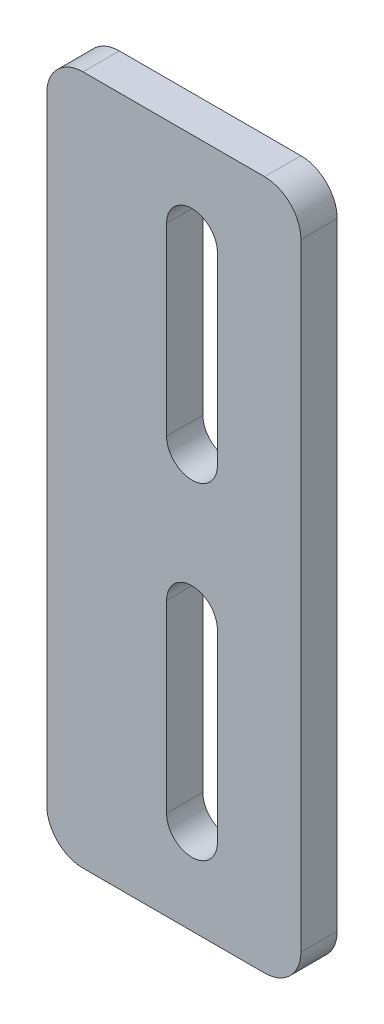
ISO-10303-21;
HEADER;
FILE_DESCRIPTION(('STEP AP214'),'2;1');
FILE_NAME('part.step','',(''),(''),'','','');
FILE_SCHEMA(('AUTOMOTIVE_DESIGN { 1 0 10303 214 1 1 1 1 }'));
ENDSEC;
DATA;
#1=APPLICATION_CONTEXT('core data for automotive mechanical design processes');
#2=APPLICATION_PROTOCOL_DEFINITION('international standard','automotive_design',2000,#1);
#3=PRODUCT_CONTEXT('',#1,'mechanical');
#4=PRODUCT('Part','Part','',(#3));
#5=PRODUCT_RELATED_PRODUCT_CATEGORY('part','',(#4));
#6=PRODUCT_DEFINITION_FORMATION('','',#4);
#7=PRODUCT_DEFINITION_CONTEXT('part definition',#1,'design');
#8=PRODUCT_DEFINITION('design','',#6,#7);
#9=PRODUCT_DEFINITION_SHAPE('','',#8);
#10=(LENGTH_UNIT() NAMED_UNIT(*) SI_UNIT(.MILLI.,.METRE.));
#11=(NAMED_UNIT(*) PLANE_ANGLE_UNIT() SI_UNIT($,.RADIAN.));
#12=(NAMED_UNIT(*) SI_UNIT($,.STERADIAN.) SOLID_ANGLE_UNIT());
#13=UNCERTAINTY_MEASURE_WITH_UNIT(LENGTH_MEASURE(1.E-05),#10,'distance_accuracy_value','');
#14=(GEOMETRIC_REPRESENTATION_CONTEXT(3) GLOBAL_UNCERTAINTY_ASSIGNED_CONTEXT((#13)) GLOBAL_UNIT_ASSIGNED_CONTEXT((#10,
#11,#12)) REPRESENTATION_CONTEXT('',''));
#15=CARTESIAN_POINT('',(0.,0.,0.));
#16=DIRECTION('',(0.,0.,1.));
#17=DIRECTION('',(1.,0.,0.));
#18=AXIS2_PLACEMENT_3D('',#15,#16,#17);
#19=CARTESIAN_POINT('',(6.66133814775094E-13,-64.4730000000013,5.));
#20=DIRECTION('',(0.,1.,0.));
#21=DIRECTION('',(-1.,0.,0.));
#22=AXIS2_PLACEMENT_3D('',#19,#20,#21);
#23=PLANE('',#22);
#24=DIRECTION('',(1.,0.,0.));
#25=VECTOR('',#24,1.);
#26=CARTESIAN_POINT('',(6.66133814775094E-13,-64.4730000000013,5.));
#27=LINE('',#26,#25);
#28=CARTESIAN_POINT('',(5.00000000000068,-64.4730000000013,5.));
#29=VERTEX_POINT('',#28);
#30=CARTESIAN_POINT('',(30.0000000000001,-64.4730000000013,5.));
#31=VERTEX_POINT('',#30);
#32=EDGE_CURVE('E215',#29,#31,#27,.T.);
#33=ORIENTED_EDGE('',*,*,#32,.F.);
#34=DIRECTION('',(0.,0.,-1.));
#35=VECTOR('',#34,1.);
#36=CARTESIAN_POINT('',(5.00000000000067,-64.4730000000013,0.));
#37=LINE('',#36,#35);
#38=CARTESIAN_POINT('',(5.00000000000068,-64.4730000000013,0.));
#39=VERTEX_POINT('',#38);
#40=EDGE_CURVE('E295',#29,#39,#37,.T.);
#41=ORIENTED_EDGE('',*,*,#40,.T.);
#42=DIRECTION('',(1.,0.,0.));
#43=VECTOR('',#42,1.);
#44=CARTESIAN_POINT('',(6.66133814775094E-13,-64.4730000000013,0.));
#45=LINE('',#44,#43);
#46=CARTESIAN_POINT('',(30.0000000000001,-64.4730000000013,0.));
#47=VERTEX_POINT('',#46);
#48=EDGE_CURVE('E258',#39,#47,#45,.T.);
#49=ORIENTED_EDGE('',*,*,#48,.T.);
#50=DIRECTION('',(0.,0.,-1.));
#51=VECTOR('',#50,1.);
#52=CARTESIAN_POINT('',(30.,-64.4730000000013,5.));
#53=LINE('',#52,#51);
#54=EDGE_CURVE('E281',#47,#31,#53,.F.);
#55=ORIENTED_EDGE('',*,*,#54,.T.);
#56=EDGE_LOOP('',(#33,#41,#49,#55));
#57=FACE_BOUND('',#56,.T.);
#58=ADVANCED_FACE('F44',(#57),#23,.F.);
#59=CARTESIAN_POINT('',(35.,0.,5.));
#60=DIRECTION('',(-1.,0.,0.));
#61=DIRECTION('',(0.,-1.,0.));
#62=AXIS2_PLACEMENT_3D('',#59,#60,#61);
#63=PLANE('',#62);
#64=DIRECTION('',(0.,1.,0.));
#65=VECTOR('',#64,1.);
#66=CARTESIAN_POINT('',(35.,0.,5.));
#67=LINE('',#66,#65);
#68=CARTESIAN_POINT('',(35.,-59.4730000000015,5.));
#69=VERTEX_POINT('',#68);
#70=CARTESIAN_POINT('',(35.,25.5269999999994,5.));
#71=VERTEX_POINT('',#70);
#72=EDGE_CURVE('E216',#69,#71,#67,.T.);
#73=ORIENTED_EDGE('',*,*,#72,.F.);
#74=DIRECTION('',(0.,0.,-1.));
#75=VECTOR('',#74,1.);
#76=CARTESIAN_POINT('',(35.,-59.4730000000013,5.));
#77=LINE('',#76,#75);
#78=CARTESIAN_POINT('',(35.,-59.4730000000015,0.));
#79=VERTEX_POINT('',#78);
#80=EDGE_CURVE('E328',#69,#79,#77,.T.);
#81=ORIENTED_EDGE('',*,*,#80,.T.);
#82=DIRECTION('',(0.,1.,0.));
#83=VECTOR('',#82,1.);
#84=CARTESIAN_POINT('',(35.,0.,0.));
#85=LINE('',#84,#83);
#86=CARTESIAN_POINT('',(35.,25.5269999999994,0.));
#87=VERTEX_POINT('',#86);
#88=EDGE_CURVE('E257',#79,#87,#85,.T.);
#89=ORIENTED_EDGE('',*,*,#88,.T.);
#90=DIRECTION('',(0.,0.,-1.));
#91=VECTOR('',#90,1.);
#92=CARTESIAN_POINT('',(35.,25.5269999999993,5.));
#93=LINE('',#92,#91);
#94=EDGE_CURVE('E326',#87,#71,#93,.F.);
#95=ORIENTED_EDGE('',*,*,#94,.T.);
#96=EDGE_LOOP('',(#73,#81,#89,#95));
#97=FACE_BOUND('',#96,.T.);
#98=ADVANCED_FACE('F336',(#97),#63,.F.);
#99=CARTESIAN_POINT('',(1.33226762955019E-12,30.5269999999993,5.));
#100=DIRECTION('',(0.,1.,0.));
#101=DIRECTION('',(-1.,0.,0.));
#102=AXIS2_PLACEMENT_3D('',#99,#100,#101);
#103=PLANE('',#102);
#104=DIRECTION('',(1.,0.,0.));
#105=VECTOR('',#104,1.);
#106=CARTESIAN_POINT('',(1.33226762955019E-12,30.5269999999993,5.));
#107=LINE('',#106,#105);
#108=CARTESIAN_POINT('',(5.00000000000068,30.5269999999993,5.));
#109=VERTEX_POINT('',#108);
#110=CARTESIAN_POINT('',(30.0000000000001,30.5269999999993,5.));
#111=VERTEX_POINT('',#110);
#112=EDGE_CURVE('E218',#109,#111,#107,.T.);
#113=ORIENTED_EDGE('',*,*,#112,.T.);
#114=DIRECTION('',(0.,0.,-1.));
#115=VECTOR('',#114,1.);
#116=CARTESIAN_POINT('',(30.,30.5269999999993,0.));
#117=LINE('',#116,#115);
#118=CARTESIAN_POINT('',(30.0000000000001,30.5269999999993,0.));
#119=VERTEX_POINT('',#118);
#120=EDGE_CURVE('E11',#111,#119,#117,.T.);
#121=ORIENTED_EDGE('',*,*,#120,.T.);
#122=DIRECTION('',(1.,0.,0.));
#123=VECTOR('',#122,1.);
#124=CARTESIAN_POINT('',(1.33226762955019E-12,30.5269999999993,0.));
#125=LINE('',#124,#123);
#126=CARTESIAN_POINT('',(5.00000000000068,30.5269999999993,0.));
#127=VERTEX_POINT('',#126);
#128=EDGE_CURVE('E262',#127,#119,#125,.T.);
#129=ORIENTED_EDGE('',*,*,#128,.F.);
#130=DIRECTION('',(0.,0.,-1.));
#131=VECTOR('',#130,1.);
#132=CARTESIAN_POINT('',(5.00000000000067,30.5269999999993,5.));
#133=LINE('',#132,#131);
#134=EDGE_CURVE('E53',#127,#109,#133,.F.);
#135=ORIENTED_EDGE('',*,*,#134,.T.);
#136=EDGE_LOOP('',(#113,#121,#129,#135));
#137=FACE_BOUND('',#136,.T.);
#138=ADVANCED_FACE('F350',(#137),#103,.T.);
#139=CARTESIAN_POINT('',(20.000000000001,-26.7730000000006,5.));
#140=DIRECTION('',(0.,0.,-1.));
#141=DIRECTION('',(-1.,0.,0.));
#142=AXIS2_PLACEMENT_3D('',#139,#140,#141);
#143=CYLINDRICAL_SURFACE('',#142,3.5);
#144=CARTESIAN_POINT('',(20.000000000001,-26.7730000000006,0.));
#145=DIRECTION('',(0.,0.,1.));
#146=DIRECTION('',(1.,0.,0.));
#147=AXIS2_PLACEMENT_3D('',#144,#145,#146);
#148=CIRCLE('',#147,3.5);
#149=CARTESIAN_POINT('',(23.5000000000011,-26.7730000000008,0.));
#150=VERTEX_POINT('',#149);
#151=CARTESIAN_POINT('',(16.5000000000016,-26.7730000000019,0.));
#152=VERTEX_POINT('',#151);
#153=EDGE_CURVE('E238',#150,#152,#148,.T.);
#154=ORIENTED_EDGE('',*,*,#153,.F.);
#155=DIRECTION('',(0.,0.,-1.));
#156=VECTOR('',#155,1.);
#157=CARTESIAN_POINT('',(23.5000000000011,-26.7730000000008,5.));
#158=LINE('',#157,#156);
#159=CARTESIAN_POINT('',(23.5000000000011,-26.7730000000008,5.));
#160=VERTEX_POINT('',#159);
#161=EDGE_CURVE('E276',#160,#150,#158,.T.);
#162=ORIENTED_EDGE('',*,*,#161,.F.);
#163=CARTESIAN_POINT('',(20.000000000001,-26.7730000000006,5.));
#164=DIRECTION('',(0.,0.,1.));
#165=DIRECTION('',(1.,0.,0.));
#166=AXIS2_PLACEMENT_3D('',#163,#164,#165);
#167=CIRCLE('',#166,3.5);
#168=CARTESIAN_POINT('',(16.5000000000016,-26.7730000000019,5.));
#169=VERTEX_POINT('',#168);
#170=EDGE_CURVE('E198',#160,#169,#167,.T.);
#171=ORIENTED_EDGE('',*,*,#170,.T.);
#172=DIRECTION('',(0.,0.,-1.));
#173=VECTOR('',#172,1.);
#174=CARTESIAN_POINT('',(16.5000000000016,-26.7730000000019,5.));
#175=LINE('',#174,#173);
#176=EDGE_CURVE('E171',#169,#152,#175,.T.);
#177=ORIENTED_EDGE('',*,*,#176,.T.);
#178=EDGE_LOOP('',(#154,#162,#171,#177));
#179=FACE_BOUND('',#178,.T.);
#180=ADVANCED_FACE('F395',(#179),#143,.F.);
#181=CARTESIAN_POINT('',(23.5000000000022,-4.44089209850063E-13,5.));
#182=DIRECTION('',(-1.,0.,0.));
#183=DIRECTION('',(0.,-1.,0.));
#184=AXIS2_PLACEMENT_3D('',#181,#182,#183);
#185=PLANE('',#184);
#186=DIRECTION('',(0.,1.,0.));
#187=VECTOR('',#186,1.);
#188=CARTESIAN_POINT('',(23.5000000000022,-4.44089209850063E-13,0.));
#189=LINE('',#188,#187);
#190=CARTESIAN_POINT('',(23.5000000000011,-52.173000000002,0.));
#191=VERTEX_POINT('',#190);
#192=EDGE_CURVE('E243',#191,#150,#189,.T.);
#193=ORIENTED_EDGE('',*,*,#192,.F.);
#194=DIRECTION('',(0.,0.,-1.));
#195=VECTOR('',#194,1.);
#196=CARTESIAN_POINT('',(23.5000000000011,-52.173000000002,5.));
#197=LINE('',#196,#195);
#198=CARTESIAN_POINT('',(23.5000000000011,-52.173000000002,5.));
#199=VERTEX_POINT('',#198);
#200=EDGE_CURVE('E277',#199,#191,#197,.T.);
#201=ORIENTED_EDGE('',*,*,#200,.F.);
#202=DIRECTION('',(0.,1.,0.));
#203=VECTOR('',#202,1.);
#204=CARTESIAN_POINT('',(23.5000000000022,-4.44089209850063E-13,5.));
#205=LINE('',#204,#203);
#206=EDGE_CURVE('E199',#199,#160,#205,.T.);
#207=ORIENTED_EDGE('',*,*,#206,.T.);
#208=ORIENTED_EDGE('',*,*,#161,.T.);
#209=EDGE_LOOP('',(#193,#201,#207,#208));
#210=FACE_BOUND('',#209,.T.);
#211=ADVANCED_FACE('F386',(#210),#185,.T.);
#212=CARTESIAN_POINT('',(20.000000000001,-52.1730000000007,5.));
#213=DIRECTION('',(0.,0.,-1.));
#214=DIRECTION('',(-1.,0.,0.));
#215=AXIS2_PLACEMENT_3D('',#212,#213,#214);
#216=CYLINDRICAL_SURFACE('',#215,3.5);
#217=CARTESIAN_POINT('',(20.000000000001,-52.1730000000007,0.));
#218=DIRECTION('',(0.,0.,1.));
#219=DIRECTION('',(1.,0.,0.));
#220=AXIS2_PLACEMENT_3D('',#217,#218,#219);
#221=CIRCLE('',#220,3.5);
#222=CARTESIAN_POINT('',(16.5000000000022,-52.1730000000008,0.));
#223=VERTEX_POINT('',#222);
#224=EDGE_CURVE('E246',#223,#191,#221,.T.);
#225=ORIENTED_EDGE('',*,*,#224,.F.);
#226=DIRECTION('',(0.,0.,-1.));
#227=VECTOR('',#226,1.);
#228=CARTESIAN_POINT('',(16.5000000000022,-52.1730000000008,5.));
#229=LINE('',#228,#227);
#230=CARTESIAN_POINT('',(16.5000000000022,-52.1730000000008,5.));
#231=VERTEX_POINT('',#230);
#232=EDGE_CURVE('E272',#231,#223,#229,.T.);
#233=ORIENTED_EDGE('',*,*,#232,.F.);
#234=CARTESIAN_POINT('',(20.000000000001,-52.1730000000007,5.));
#235=DIRECTION('',(0.,0.,1.));
#236=DIRECTION('',(1.,0.,0.));
#237=AXIS2_PLACEMENT_3D('',#234,#235,#236);
#238=CIRCLE('',#237,3.5);
#239=EDGE_CURVE('E204',#231,#199,#238,.T.);
#240=ORIENTED_EDGE('',*,*,#239,.T.);
#241=ORIENTED_EDGE('',*,*,#200,.T.);
#242=EDGE_LOOP('',(#225,#233,#240,#241));
#243=FACE_BOUND('',#242,.T.);
#244=ADVANCED_FACE('F387',(#243),#216,.F.);
#245=CARTESIAN_POINT('',(20.0000000000021,-7.17300000000054,5.));
#246=DIRECTION('',(0.,0.,-1.));
#247=DIRECTION('',(-1.,0.,0.));
#248=AXIS2_PLACEMENT_3D('',#245,#246,#247);
#249=CYLINDRICAL_SURFACE('',#248,3.5);
#250=CARTESIAN_POINT('',(20.0000000000021,-7.17300000000054,0.));
#251=DIRECTION('',(0.,0.,1.));
#252=DIRECTION('',(1.,0.,0.));
#253=AXIS2_PLACEMENT_3D('',#250,#251,#252);
#254=CIRCLE('',#253,3.5);
#255=CARTESIAN_POINT('',(16.5000000000015,-7.17300000000076,0.));
#256=VERTEX_POINT('',#255);
#257=CARTESIAN_POINT('',(23.5000000000022,-7.17300000000076,0.));
#258=VERTEX_POINT('',#257);
#259=EDGE_CURVE('E167',#256,#258,#254,.T.);
#260=ORIENTED_EDGE('',*,*,#259,.F.);
#261=DIRECTION('',(0.,0.,-1.));
#262=VECTOR('',#261,1.);
#263=CARTESIAN_POINT('',(16.5000000000015,-7.17300000000076,5.));
#264=LINE('',#263,#262);
#265=CARTESIAN_POINT('',(16.5000000000015,-7.17300000000076,5.));
#266=VERTEX_POINT('',#265);
#267=EDGE_CURVE('E159',#266,#256,#264,.T.);
#268=ORIENTED_EDGE('',*,*,#267,.F.);
#269=CARTESIAN_POINT('',(20.0000000000021,-7.17300000000054,5.));
#270=DIRECTION('',(0.,0.,1.));
#271=DIRECTION('',(1.,0.,0.));
#272=AXIS2_PLACEMENT_3D('',#269,#270,#271);
#273=CIRCLE('',#272,3.5);
#274=CARTESIAN_POINT('',(23.5000000000022,-7.17300000000076,5.));
#275=VERTEX_POINT('',#274);
#276=EDGE_CURVE('E162',#266,#275,#273,.T.);
#277=ORIENTED_EDGE('',*,*,#276,.T.);
#278=DIRECTION('',(0.,0.,-1.));
#279=VECTOR('',#278,1.);
#280=CARTESIAN_POINT('',(23.5000000000022,-7.17300000000076,5.));
#281=LINE('',#280,#279);
#282=EDGE_CURVE('E229',#275,#258,#281,.T.);
#283=ORIENTED_EDGE('',*,*,#282,.T.);
#284=EDGE_LOOP('',(#260,#268,#277,#283));
#285=FACE_BOUND('',#284,.T.);
#286=ADVANCED_FACE('F165',(#285),#249,.F.);
#287=CARTESIAN_POINT('',(16.5000000000022,-4.44089209850063E-13,5.));
#288=DIRECTION('',(1.,0.,0.));
#289=DIRECTION('',(0.,1.,0.));
#290=AXIS2_PLACEMENT_3D('',#287,#288,#289);
#291=PLANE('',#290);
#292=DIRECTION('',(0.,-1.,0.));
#293=VECTOR('',#292,1.);
#294=CARTESIAN_POINT('',(16.5000000000022,-4.44089209850063E-13,0.));
#295=LINE('',#294,#293);
#296=CARTESIAN_POINT('',(16.5000000000021,18.2269999999993,0.));
#297=VERTEX_POINT('',#296);
#298=EDGE_CURVE('E228',#297,#256,#295,.T.);
#299=ORIENTED_EDGE('',*,*,#298,.F.);
#300=DIRECTION('',(0.,0.,-1.));
#301=VECTOR('',#300,1.);
#302=CARTESIAN_POINT('',(16.5000000000021,18.2269999999993,5.));
#303=LINE('',#302,#301);
#304=CARTESIAN_POINT('',(16.5000000000021,18.2269999999993,5.));
#305=VERTEX_POINT('',#304);
#306=EDGE_CURVE('E175',#305,#297,#303,.T.);
#307=ORIENTED_EDGE('',*,*,#306,.F.);
#308=DIRECTION('',(0.,-1.,0.));
#309=VECTOR('',#308,1.);
#310=CARTESIAN_POINT('',(16.5000000000022,-4.44089209850063E-13,5.));
#311=LINE('',#310,#309);
#312=EDGE_CURVE('E179',#305,#266,#311,.T.);
#313=ORIENTED_EDGE('',*,*,#312,.T.);
#314=ORIENTED_EDGE('',*,*,#267,.T.);
#315=EDGE_LOOP('',(#299,#307,#313,#314));
#316=FACE_BOUND('',#315,.T.);
#317=ADVANCED_FACE('F186',(#316),#291,.T.);
#318=CARTESIAN_POINT('',(20.0000000000008,18.2270000000004,5.));
#319=DIRECTION('',(0.,0.,-1.));
#320=DIRECTION('',(-1.,0.,0.));
#321=AXIS2_PLACEMENT_3D('',#318,#319,#320);
#322=CYLINDRICAL_SURFACE('',#321,3.5);
#323=CARTESIAN_POINT('',(20.0000000000008,18.2270000000004,0.));
#324=DIRECTION('',(0.,0.,1.));
#325=DIRECTION('',(1.,0.,0.));
#326=AXIS2_PLACEMENT_3D('',#323,#324,#325);
#327=CIRCLE('',#326,3.5);
#328=CARTESIAN_POINT('',(23.5000000000011,18.2269999999993,0.));
#329=VERTEX_POINT('',#328);
#330=EDGE_CURVE('E235',#329,#297,#327,.T.);
#331=ORIENTED_EDGE('',*,*,#330,.F.);
#332=DIRECTION('',(0.,0.,-1.));
#333=VECTOR('',#332,1.);
#334=CARTESIAN_POINT('',(23.5000000000011,18.2269999999993,5.));
#335=LINE('',#334,#333);
#336=CARTESIAN_POINT('',(23.5000000000011,18.2269999999993,5.));
#337=VERTEX_POINT('',#336);
#338=EDGE_CURVE('E282',#337,#329,#335,.T.);
#339=ORIENTED_EDGE('',*,*,#338,.F.);
#340=CARTESIAN_POINT('',(20.0000000000008,18.2270000000004,5.));
#341=DIRECTION('',(0.,0.,1.));
#342=DIRECTION('',(1.,0.,0.));
#343=AXIS2_PLACEMENT_3D('',#340,#341,#342);
#344=CIRCLE('',#343,3.5);
#345=EDGE_CURVE('E188',#337,#305,#344,.T.);
#346=ORIENTED_EDGE('',*,*,#345,.T.);
#347=ORIENTED_EDGE('',*,*,#306,.T.);
#348=EDGE_LOOP('',(#331,#339,#346,#347));
#349=FACE_BOUND('',#348,.T.);
#350=ADVANCED_FACE('F383',(#349),#322,.F.);
#351=CARTESIAN_POINT('',(16.5000000000022,-4.44089209850063E-13,5.));
#352=DIRECTION('',(1.,0.,0.));
#353=DIRECTION('',(0.,1.,0.));
#354=AXIS2_PLACEMENT_3D('',#351,#352,#353);
#355=PLANE('',#354);
#356=DIRECTION('',(0.,-1.,0.));
#357=VECTOR('',#356,1.);
#358=CARTESIAN_POINT('',(16.5000000000022,-4.44089209850063E-13,0.));
#359=LINE('',#358,#357);
#360=EDGE_CURVE('E252',#152,#223,#359,.T.);
#361=ORIENTED_EDGE('',*,*,#360,.F.);
#362=ORIENTED_EDGE('',*,*,#176,.F.);
#363=DIRECTION('',(0.,-1.,0.));
#364=VECTOR('',#363,1.);
#365=CARTESIAN_POINT('',(16.5000000000022,-4.44089209850063E-13,5.));
#366=LINE('',#365,#364);
#367=EDGE_CURVE('E208',#169,#231,#366,.T.);
#368=ORIENTED_EDGE('',*,*,#367,.T.);
#369=ORIENTED_EDGE('',*,*,#232,.T.);
#370=EDGE_LOOP('',(#361,#362,#368,#369));
#371=FACE_BOUND('',#370,.T.);
#372=ADVANCED_FACE('F379',(#371),#355,.T.);
#373=CARTESIAN_POINT('',(23.5000000000022,-2.22044604925031E-13,5.));
#374=DIRECTION('',(-1.,0.,0.));
#375=DIRECTION('',(0.,-1.,0.));
#376=AXIS2_PLACEMENT_3D('',#373,#374,#375);
#377=PLANE('',#376);
#378=DIRECTION('',(0.,1.,0.));
#379=VECTOR('',#378,1.);
#380=CARTESIAN_POINT('',(23.5000000000022,-2.22044604925031E-13,0.));
#381=LINE('',#380,#379);
#382=EDGE_CURVE('E237',#258,#329,#381,.T.);
#383=ORIENTED_EDGE('',*,*,#382,.F.);
#384=ORIENTED_EDGE('',*,*,#282,.F.);
#385=DIRECTION('',(0.,1.,0.));
#386=VECTOR('',#385,1.);
#387=CARTESIAN_POINT('',(23.5000000000022,-2.22044604925031E-13,5.));
#388=LINE('',#387,#386);
#389=EDGE_CURVE('E181',#275,#337,#388,.T.);
#390=ORIENTED_EDGE('',*,*,#389,.T.);
#391=ORIENTED_EDGE('',*,*,#338,.T.);
#392=EDGE_LOOP('',(#383,#384,#390,#391));
#393=FACE_BOUND('',#392,.T.);
#394=ADVANCED_FACE('F382',(#393),#377,.T.);
#395=CARTESIAN_POINT('',(6.66133814775094E-13,0.,5.));
#396=DIRECTION('',(-1.,0.,0.));
#397=DIRECTION('',(0.,-1.,0.));
#398=AXIS2_PLACEMENT_3D('',#395,#396,#397);
#399=PLANE('',#398);
#400=DIRECTION('',(0.,1.,0.));
#401=VECTOR('',#400,1.);
#402=CARTESIAN_POINT('',(6.66133814775094E-13,0.,0.));
#403=LINE('',#402,#401);
#404=CARTESIAN_POINT('',(6.66030645565807E-13,-59.4730000000015,0.));
#405=VERTEX_POINT('',#404);
#406=CARTESIAN_POINT('',(6.66178097061265E-13,25.5269999999994,0.));
#407=VERTEX_POINT('',#406);
#408=EDGE_CURVE('E183',#405,#407,#403,.T.);
#409=ORIENTED_EDGE('',*,*,#408,.F.);
#410=DIRECTION('',(0.,0.,-1.));
#411=VECTOR('',#410,1.);
#412=CARTESIAN_POINT('',(6.66030645565807E-13,-59.4730000000013,5.));
#413=LINE('',#412,#411);
#414=CARTESIAN_POINT('',(6.66030645565807E-13,-59.4730000000015,5.));
#415=VERTEX_POINT('',#414);
#416=EDGE_CURVE('E315',#405,#415,#413,.F.);
#417=ORIENTED_EDGE('',*,*,#416,.T.);
#418=DIRECTION('',(0.,1.,0.));
#419=VECTOR('',#418,1.);
#420=CARTESIAN_POINT('',(6.66133814775094E-13,0.,5.));
#421=LINE('',#420,#419);
#422=CARTESIAN_POINT('',(6.66178097061265E-13,25.5269999999994,5.));
#423=VERTEX_POINT('',#422);
#424=EDGE_CURVE('E225',#415,#423,#421,.T.);
#425=ORIENTED_EDGE('',*,*,#424,.T.);
#426=DIRECTION('',(0.,0.,-1.));
#427=VECTOR('',#426,1.);
#428=CARTESIAN_POINT('',(6.66178097061265E-13,25.5269999999993,5.));
#429=LINE('',#428,#427);
#430=EDGE_CURVE('E306',#423,#407,#429,.T.);
#431=ORIENTED_EDGE('',*,*,#430,.T.);
#432=EDGE_LOOP('',(#409,#417,#425,#431));
#433=FACE_BOUND('',#432,.T.);
#434=ADVANCED_FACE('F353',(#433),#399,.T.);
#435=CARTESIAN_POINT('',(0.,0.,5.));
#436=DIRECTION('',(0.,0.,1.));
#437=DIRECTION('',(1.,0.,0.));
#438=AXIS2_PLACEMENT_3D('',#435,#436,#437);
#439=PLANE('',#438);
#440=ORIENTED_EDGE('',*,*,#276,.F.);
#441=ORIENTED_EDGE('',*,*,#312,.F.);
#442=ORIENTED_EDGE('',*,*,#345,.F.);
#443=ORIENTED_EDGE('',*,*,#389,.F.);
#444=EDGE_LOOP('',(#440,#441,#442,#443));
#445=FACE_BOUND('',#444,.T.);
#446=ORIENTED_EDGE('',*,*,#170,.F.);
#447=ORIENTED_EDGE('',*,*,#206,.F.);
#448=ORIENTED_EDGE('',*,*,#239,.F.);
#449=ORIENTED_EDGE('',*,*,#367,.F.);
#450=EDGE_LOOP('',(#446,#447,#448,#449));
#451=FACE_BOUND('',#450,.T.);
#452=ORIENTED_EDGE('',*,*,#424,.F.);
#453=CARTESIAN_POINT('',(5.00000000000067,-59.4730000000013,5.));
#454=DIRECTION('',(0.,0.,1.));
#455=DIRECTION('',(0.,-1.,0.));
#456=AXIS2_PLACEMENT_3D('',#453,#454,#455);
#457=CIRCLE('',#456,5.);
#458=EDGE_CURVE('E323',#415,#29,#457,.T.);
#459=ORIENTED_EDGE('',*,*,#458,.T.);
#460=ORIENTED_EDGE('',*,*,#32,.T.);
#461=CARTESIAN_POINT('',(30.,-59.4730000000013,5.));
#462=DIRECTION('',(0.,0.,1.));
#463=DIRECTION('',(0.,-1.,0.));
#464=AXIS2_PLACEMENT_3D('',#461,#462,#463);
#465=CIRCLE('',#464,5.);
#466=EDGE_CURVE('E319',#31,#69,#465,.T.);
#467=ORIENTED_EDGE('',*,*,#466,.T.);
#468=ORIENTED_EDGE('',*,*,#72,.T.);
#469=CARTESIAN_POINT('',(30.,25.5269999999993,5.));
#470=DIRECTION('',(0.,0.,1.));
#471=DIRECTION('',(0.,-1.,0.));
#472=AXIS2_PLACEMENT_3D('',#469,#470,#471);
#473=CIRCLE('',#472,5.);
#474=EDGE_CURVE('E64',#71,#111,#473,.T.);
#475=ORIENTED_EDGE('',*,*,#474,.T.);
#476=ORIENTED_EDGE('',*,*,#112,.F.);
#477=CARTESIAN_POINT('',(5.00000000000067,25.5269999999993,5.));
#478=DIRECTION('',(0.,0.,1.));
#479=DIRECTION('',(0.,-1.,0.));
#480=AXIS2_PLACEMENT_3D('',#477,#478,#479);
#481=CIRCLE('',#480,5.);
#482=EDGE_CURVE('E312',#109,#423,#481,.T.);
#483=ORIENTED_EDGE('',*,*,#482,.T.);
#484=EDGE_LOOP('',(#452,#459,#460,#467,#468,#475,#476,#483));
#485=FACE_BOUND('',#484,.T.);
#486=ADVANCED_FACE('F180',(#445,#451,#485),#439,.T.);
#487=CARTESIAN_POINT('',(0.,0.,0.));
#488=DIRECTION('',(0.,0.,1.));
#489=DIRECTION('',(1.,0.,0.));
#490=AXIS2_PLACEMENT_3D('',#487,#488,#489);
#491=PLANE('',#490);
#492=ORIENTED_EDGE('',*,*,#259,.T.);
#493=ORIENTED_EDGE('',*,*,#382,.T.);
#494=ORIENTED_EDGE('',*,*,#330,.T.);
#495=ORIENTED_EDGE('',*,*,#298,.T.);
#496=EDGE_LOOP('',(#492,#493,#494,#495));
#497=FACE_BOUND('',#496,.T.);
#498=ORIENTED_EDGE('',*,*,#153,.T.);
#499=ORIENTED_EDGE('',*,*,#360,.T.);
#500=ORIENTED_EDGE('',*,*,#224,.T.);
#501=ORIENTED_EDGE('',*,*,#192,.T.);
#502=EDGE_LOOP('',(#498,#499,#500,#501));
#503=FACE_BOUND('',#502,.T.);
#504=ORIENTED_EDGE('',*,*,#48,.F.);
#505=CARTESIAN_POINT('',(5.00000000000067,-59.4730000000013,0.));
#506=DIRECTION('',(0.,0.,1.));
#507=DIRECTION('',(0.,-1.,0.));
#508=AXIS2_PLACEMENT_3D('',#505,#506,#507);
#509=CIRCLE('',#508,5.);
#510=EDGE_CURVE('E304',#39,#405,#509,.F.);
#511=ORIENTED_EDGE('',*,*,#510,.T.);
#512=ORIENTED_EDGE('',*,*,#408,.T.);
#513=CARTESIAN_POINT('',(5.00000000000067,25.5269999999993,0.));
#514=DIRECTION('',(0.,0.,1.));
#515=DIRECTION('',(0.,-1.,0.));
#516=AXIS2_PLACEMENT_3D('',#513,#514,#515);
#517=CIRCLE('',#516,5.);
#518=EDGE_CURVE('E299',#407,#127,#517,.F.);
#519=ORIENTED_EDGE('',*,*,#518,.T.);
#520=ORIENTED_EDGE('',*,*,#128,.T.);
#521=CARTESIAN_POINT('',(30.,25.5269999999993,0.));
#522=DIRECTION('',(0.,0.,1.));
#523=DIRECTION('',(0.,-1.,0.));
#524=AXIS2_PLACEMENT_3D('',#521,#522,#523);
#525=CIRCLE('',#524,5.);
#526=EDGE_CURVE('E298',#119,#87,#525,.F.);
#527=ORIENTED_EDGE('',*,*,#526,.T.);
#528=ORIENTED_EDGE('',*,*,#88,.F.);
#529=CARTESIAN_POINT('',(30.,-59.4730000000013,0.));
#530=DIRECTION('',(0.,0.,1.));
#531=DIRECTION('',(0.,-1.,0.));
#532=AXIS2_PLACEMENT_3D('',#529,#530,#531);
#533=CIRCLE('',#532,5.);
#534=EDGE_CURVE('E305',#79,#47,#533,.F.);
#535=ORIENTED_EDGE('',*,*,#534,.T.);
#536=EDGE_LOOP('',(#504,#511,#512,#519,#520,#527,#528,#535));
#537=FACE_BOUND('',#536,.T.);
#538=ADVANCED_FACE('F341',(#497,#503,#537),#491,.F.);
#539=CARTESIAN_POINT('',(5.00000000000067,-59.4730000000013,5.));
#540=DIRECTION('',(0.,0.,1.));
#541=DIRECTION('',(1.,0.,0.));
#542=AXIS2_PLACEMENT_3D('',#539,#540,#541);
#543=CYLINDRICAL_SURFACE('',#542,5.);
#544=ORIENTED_EDGE('',*,*,#458,.F.);
#545=ORIENTED_EDGE('',*,*,#416,.F.);
#546=ORIENTED_EDGE('',*,*,#510,.F.);
#547=ORIENTED_EDGE('',*,*,#40,.F.);
#548=EDGE_LOOP('',(#544,#545,#546,#547));
#549=FACE_BOUND('',#548,.T.);
#550=ADVANCED_FACE('F357',(#549),#543,.T.);
#551=CARTESIAN_POINT('',(30.,-59.4730000000013,5.));
#552=DIRECTION('',(0.,0.,-1.));
#553=DIRECTION('',(-1.,0.,0.));
#554=AXIS2_PLACEMENT_3D('',#551,#552,#553);
#555=CYLINDRICAL_SURFACE('',#554,5.);
#556=ORIENTED_EDGE('',*,*,#466,.F.);
#557=ORIENTED_EDGE('',*,*,#54,.F.);
#558=ORIENTED_EDGE('',*,*,#534,.F.);
#559=ORIENTED_EDGE('',*,*,#80,.F.);
#560=EDGE_LOOP('',(#556,#557,#558,#559));
#561=FACE_BOUND('',#560,.T.);
#562=ADVANCED_FACE('F361',(#561),#555,.T.);
#563=CARTESIAN_POINT('',(30.,25.5269999999993,5.));
#564=DIRECTION('',(0.,0.,1.));
#565=DIRECTION('',(1.,0.,0.));
#566=AXIS2_PLACEMENT_3D('',#563,#564,#565);
#567=CYLINDRICAL_SURFACE('',#566,5.);
#568=ORIENTED_EDGE('',*,*,#474,.F.);
#569=ORIENTED_EDGE('',*,*,#94,.F.);
#570=ORIENTED_EDGE('',*,*,#526,.F.);
#571=ORIENTED_EDGE('',*,*,#120,.F.);
#572=EDGE_LOOP('',(#568,#569,#570,#571));
#573=FACE_BOUND('',#572,.T.);
#574=ADVANCED_FACE('F347',(#573),#567,.T.);
#575=CARTESIAN_POINT('',(5.00000000000067,25.5269999999993,5.));
#576=DIRECTION('',(0.,0.,-1.));
#577=DIRECTION('',(-1.,0.,0.));
#578=AXIS2_PLACEMENT_3D('',#575,#576,#577);
#579=CYLINDRICAL_SURFACE('',#578,5.);
#580=ORIENTED_EDGE('',*,*,#482,.F.);
#581=ORIENTED_EDGE('',*,*,#134,.F.);
#582=ORIENTED_EDGE('',*,*,#518,.F.);
#583=ORIENTED_EDGE('',*,*,#430,.F.);
#584=EDGE_LOOP('',(#580,#581,#582,#583));
#585=FACE_BOUND('',#584,.T.);
#586=ADVANCED_FACE('F50',(#585),#579,.T.);
#587=CLOSED_SHELL('',(#58,#98,#138,#180,#211,#244,#286,#317,#350,#372,#394,#434,#486,#538,#550,
#562,#574,#586));
#588=MANIFOLD_SOLID_BREP('B2',#587);
#589=ADVANCED_BREP_SHAPE_REPRESENTATION('',(#18,#588),#14);
#590=SHAPE_DEFINITION_REPRESENTATION(#9,#589);
ENDSEC;
END-ISO-10303-21;
